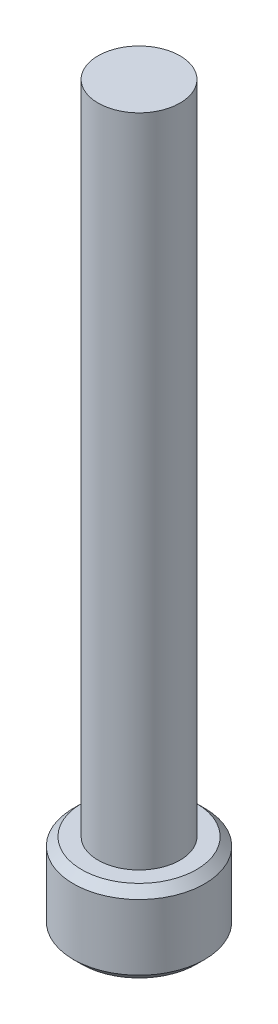
ISO-10303-21;
HEADER;
FILE_DESCRIPTION(('STEP AP214'),'2;1');
FILE_NAME('part.step','',(''),(''),'','','');
FILE_SCHEMA(('AUTOMOTIVE_DESIGN { 1 0 10303 214 1 1 1 1 }'));
ENDSEC;
DATA;
#1=APPLICATION_CONTEXT('core data for automotive mechanical design processes');
#2=APPLICATION_PROTOCOL_DEFINITION('international standard','automotive_design',2000,#1);
#3=PRODUCT_CONTEXT('',#1,'mechanical');
#4=PRODUCT('Part','Part','',(#3));
#5=PRODUCT_RELATED_PRODUCT_CATEGORY('part','',(#4));
#6=PRODUCT_DEFINITION_FORMATION('','',#4);
#7=PRODUCT_DEFINITION_CONTEXT('part definition',#1,'design');
#8=PRODUCT_DEFINITION('design','',#6,#7);
#9=PRODUCT_DEFINITION_SHAPE('','',#8);
#10=(LENGTH_UNIT() NAMED_UNIT(*) SI_UNIT(.MILLI.,.METRE.));
#11=(NAMED_UNIT(*) PLANE_ANGLE_UNIT() SI_UNIT($,.RADIAN.));
#12=(NAMED_UNIT(*) SI_UNIT($,.STERADIAN.) SOLID_ANGLE_UNIT());
#13=UNCERTAINTY_MEASURE_WITH_UNIT(LENGTH_MEASURE(1.E-05),#10,'distance_accuracy_value','');
#14=(GEOMETRIC_REPRESENTATION_CONTEXT(3) GLOBAL_UNCERTAINTY_ASSIGNED_CONTEXT((#13)) GLOBAL_UNIT_ASSIGNED_CONTEXT((#10,
#11,#12)) REPRESENTATION_CONTEXT('',''));
#15=CARTESIAN_POINT('',(0.,0.,0.));
#16=DIRECTION('',(0.,0.,1.));
#17=DIRECTION('',(1.,0.,0.));
#18=AXIS2_PLACEMENT_3D('',#15,#16,#17);
#19=CARTESIAN_POINT('',(0.,40.,0.));
#20=DIRECTION('',(0.,-1.,0.));
#21=DIRECTION('',(0.,0.,-1.));
#22=AXIS2_PLACEMENT_3D('',#19,#20,#21);
#23=CYLINDRICAL_SURFACE('',#22,2.5);
#24=CARTESIAN_POINT('',(0.,40.,0.));
#25=DIRECTION('',(0.,1.,0.));
#26=DIRECTION('',(0.,0.,1.));
#27=AXIS2_PLACEMENT_3D('',#24,#25,#26);
#28=CIRCLE('',#27,2.5);
#29=CARTESIAN_POINT('',(0.,40.,2.5));
#30=VERTEX_POINT('',#29);
#31=EDGE_CURVE('E126',#30,#30,#28,.T.);
#32=ORIENTED_EDGE('',*,*,#31,.F.);
#33=EDGE_LOOP('',(#32));
#34=FACE_BOUND('',#33,.T.);
#35=CARTESIAN_POINT('',(0.,0.,0.));
#36=DIRECTION('',(0.,-1.,0.));
#37=DIRECTION('',(0.,0.,-1.));
#38=AXIS2_PLACEMENT_3D('',#35,#36,#37);
#39=CIRCLE('',#38,2.5);
#40=CARTESIAN_POINT('',(0.,0.,-2.5));
#41=VERTEX_POINT('',#40);
#42=EDGE_CURVE('E116',#41,#41,#39,.T.);
#43=ORIENTED_EDGE('',*,*,#42,.F.);
#44=EDGE_LOOP('',(#43));
#45=FACE_BOUND('',#44,.T.);
#46=ADVANCED_FACE('F32',(#34,#45),#23,.T.);
#47=CARTESIAN_POINT('',(0.,40.,0.));
#48=DIRECTION('',(0.,1.,0.));
#49=DIRECTION('',(0.,0.,1.));
#50=AXIS2_PLACEMENT_3D('',#47,#48,#49);
#51=PLANE('',#50);
#52=ORIENTED_EDGE('',*,*,#31,.T.);
#53=EDGE_LOOP('',(#52));
#54=FACE_BOUND('',#53,.T.);
#55=ADVANCED_FACE('F184',(#54),#51,.T.);
#56=CARTESIAN_POINT('',(0.,0.,0.));
#57=DIRECTION('',(0.,-1.,0.));
#58=DIRECTION('',(0.,0.,-1.));
#59=AXIS2_PLACEMENT_3D('',#56,#57,#58);
#60=PLANE('',#59);
#61=CARTESIAN_POINT('',(0.,0.,0.));
#62=DIRECTION('',(0.,-1.,0.));
#63=DIRECTION('',(0.,0.,-1.));
#64=AXIS2_PLACEMENT_3D('',#61,#62,#63);
#65=CIRCLE('',#64,3.49999999999999);
#66=CARTESIAN_POINT('',(0.,0.,-3.49999999999999));
#67=VERTEX_POINT('',#66);
#68=EDGE_CURVE('E11',#67,#67,#65,.F.);
#69=ORIENTED_EDGE('',*,*,#68,.T.);
#70=EDGE_LOOP('',(#69));
#71=FACE_BOUND('',#70,.T.);
#72=ORIENTED_EDGE('',*,*,#42,.T.);
#73=EDGE_LOOP('',(#72));
#74=FACE_BOUND('',#73,.T.);
#75=ADVANCED_FACE('F190',(#71,#74),#60,.F.);
#76=CARTESIAN_POINT('',(0.,-5.,0.));
#77=DIRECTION('',(0.,-1.,0.));
#78=DIRECTION('',(0.,0.,-1.));
#79=AXIS2_PLACEMENT_3D('',#76,#77,#78);
#80=CYLINDRICAL_SURFACE('',#79,4.);
#81=CARTESIAN_POINT('',(0.,-4.5,0.));
#82=DIRECTION('',(0.,1.,0.));
#83=DIRECTION('',(0.,0.,1.));
#84=AXIS2_PLACEMENT_3D('',#81,#82,#83);
#85=CIRCLE('',#84,4.);
#86=CARTESIAN_POINT('',(0.,-4.5,4.));
#87=VERTEX_POINT('',#86);
#88=EDGE_CURVE('E40',#87,#87,#85,.T.);
#89=ORIENTED_EDGE('',*,*,#88,.T.);
#90=EDGE_LOOP('',(#89));
#91=FACE_BOUND('',#90,.T.);
#92=CARTESIAN_POINT('',(0.,-0.500000000000007,0.));
#93=DIRECTION('',(0.,-1.,0.));
#94=DIRECTION('',(0.,0.,-1.));
#95=AXIS2_PLACEMENT_3D('',#92,#93,#94);
#96=CIRCLE('',#95,4.);
#97=CARTESIAN_POINT('',(0.,-0.500000000000007,-4.));
#98=VERTEX_POINT('',#97);
#99=EDGE_CURVE('E146',#98,#98,#96,.T.);
#100=ORIENTED_EDGE('',*,*,#99,.T.);
#101=EDGE_LOOP('',(#100));
#102=FACE_BOUND('',#101,.T.);
#103=ADVANCED_FACE('F151',(#91,#102),#80,.T.);
#104=CARTESIAN_POINT('',(-4.,-5.,0.));
#105=DIRECTION('',(0.,1.,0.));
#106=DIRECTION('',(0.,0.,1.));
#107=AXIS2_PLACEMENT_3D('',#104,#105,#106);
#108=PLANE('',#107);
#109=CARTESIAN_POINT('',(0.,-5.,0.));
#110=DIRECTION('',(0.,1.,0.));
#111=DIRECTION('',(0.,0.,1.));
#112=AXIS2_PLACEMENT_3D('',#109,#110,#111);
#113=CIRCLE('',#112,3.5);
#114=CARTESIAN_POINT('',(0.,-5.,3.5));
#115=VERTEX_POINT('',#114);
#116=EDGE_CURVE('E143',#115,#115,#113,.F.);
#117=ORIENTED_EDGE('',*,*,#116,.T.);
#118=EDGE_LOOP('',(#117));
#119=FACE_BOUND('',#118,.T.);
#120=DIRECTION('',(1.,0.,0.));
#121=VECTOR('',#120,1.);
#122=CARTESIAN_POINT('',(-4.,-5.,2.5));
#123=LINE('',#122,#121);
#124=CARTESIAN_POINT('',(-1.44337567297406,-5.,2.5));
#125=VERTEX_POINT('',#124);
#126=CARTESIAN_POINT('',(1.44337567297407,-5.,2.5));
#127=VERTEX_POINT('',#126);
#128=EDGE_CURVE('E139',#125,#127,#123,.T.);
#129=ORIENTED_EDGE('',*,*,#128,.T.);
#130=DIRECTION('',(0.5,0.,-0.866025403784439));
#131=VECTOR('',#130,1.);
#132=CARTESIAN_POINT('',(1.1650635094611,-5.,2.98205080756888));
#133=LINE('',#132,#131);
#134=CARTESIAN_POINT('',(2.88675134594813,-5.,0.));
#135=VERTEX_POINT('',#134);
#136=EDGE_CURVE('E55',#127,#135,#133,.T.);
#137=ORIENTED_EDGE('',*,*,#136,.T.);
#138=DIRECTION('',(-0.5,0.,-0.866025403784439));
#139=VECTOR('',#138,1.);
#140=CARTESIAN_POINT('',(1.1650635094611,-5.,-2.98205080756888));
#141=LINE('',#140,#139);
#142=CARTESIAN_POINT('',(1.44337567297406,-5.,-2.5));
#143=VERTEX_POINT('',#142);
#144=EDGE_CURVE('E88',#135,#143,#141,.T.);
#145=ORIENTED_EDGE('',*,*,#144,.T.);
#146=DIRECTION('',(-1.,0.,0.));
#147=VECTOR('',#146,1.);
#148=CARTESIAN_POINT('',(-4.,-5.,-2.5));
#149=LINE('',#148,#147);
#150=CARTESIAN_POINT('',(-1.44337567297406,-5.,-2.5));
#151=VERTEX_POINT('',#150);
#152=EDGE_CURVE('E130',#143,#151,#149,.T.);
#153=ORIENTED_EDGE('',*,*,#152,.T.);
#154=DIRECTION('',(-0.5,0.,0.866025403784439));
#155=VECTOR('',#154,1.);
#156=CARTESIAN_POINT('',(-3.1650635094611,-5.,0.482050807568877));
#157=LINE('',#156,#155);
#158=CARTESIAN_POINT('',(-2.88675134594813,-5.,0.));
#159=VERTEX_POINT('',#158);
#160=EDGE_CURVE('E133',#151,#159,#157,.T.);
#161=ORIENTED_EDGE('',*,*,#160,.T.);
#162=DIRECTION('',(0.5,0.,0.866025403784439));
#163=VECTOR('',#162,1.);
#164=CARTESIAN_POINT('',(-3.1650635094611,-5.,-0.482050807568877));
#165=LINE('',#164,#163);
#166=EDGE_CURVE('E136',#159,#125,#165,.T.);
#167=ORIENTED_EDGE('',*,*,#166,.T.);
#168=EDGE_LOOP('',(#129,#137,#145,#153,#161,#167));
#169=FACE_BOUND('',#168,.T.);
#170=ADVANCED_FACE('F159',(#119,#169),#108,.F.);
#171=CARTESIAN_POINT('',(1.44337567297407,-31.,2.5));
#172=DIRECTION('',(0.866025403784439,0.,0.5));
#173=DIRECTION('',(0.5,0.,-0.866025403784439));
#174=AXIS2_PLACEMENT_3D('',#171,#172,#173);
#175=PLANE('',#174);
#176=DIRECTION('',(0.,1.,0.));
#177=VECTOR('',#176,1.);
#178=CARTESIAN_POINT('',(1.44337567297407,-31.,2.5));
#179=LINE('',#178,#177);
#180=CARTESIAN_POINT('',(1.44337567297407,-1.,2.5));
#181=VERTEX_POINT('',#180);
#182=EDGE_CURVE('E104',#127,#181,#179,.T.);
#183=ORIENTED_EDGE('',*,*,#182,.T.);
#184=DIRECTION('',(0.5,0.,-0.866025403784439));
#185=VECTOR('',#184,1.);
#186=CARTESIAN_POINT('',(1.44337567297407,-1.,2.5));
#187=LINE('',#186,#185);
#188=CARTESIAN_POINT('',(2.88675134594813,-1.,0.));
#189=VERTEX_POINT('',#188);
#190=EDGE_CURVE('E97',#181,#189,#187,.T.);
#191=ORIENTED_EDGE('',*,*,#190,.T.);
#192=DIRECTION('',(0.,1.,0.));
#193=VECTOR('',#192,1.);
#194=CARTESIAN_POINT('',(2.88675134594813,-31.,0.));
#195=LINE('',#194,#193);
#196=EDGE_CURVE('E83',#135,#189,#195,.T.);
#197=ORIENTED_EDGE('',*,*,#196,.F.);
#198=ORIENTED_EDGE('',*,*,#136,.F.);
#199=EDGE_LOOP('',(#183,#191,#197,#198));
#200=FACE_BOUND('',#199,.T.);
#201=ADVANCED_FACE('F103',(#200),#175,.F.);
#202=CARTESIAN_POINT('',(-1.44337567297406,-31.,2.5));
#203=DIRECTION('',(0.,0.,1.));
#204=DIRECTION('',(1.,0.,0.));
#205=AXIS2_PLACEMENT_3D('',#202,#203,#204);
#206=PLANE('',#205);
#207=DIRECTION('',(0.,1.,0.));
#208=VECTOR('',#207,1.);
#209=CARTESIAN_POINT('',(-1.44337567297406,-31.,2.5));
#210=LINE('',#209,#208);
#211=CARTESIAN_POINT('',(-1.44337567297406,-1.,2.5));
#212=VERTEX_POINT('',#211);
#213=EDGE_CURVE('E117',#125,#212,#210,.T.);
#214=ORIENTED_EDGE('',*,*,#213,.T.);
#215=DIRECTION('',(1.,0.,0.));
#216=VECTOR('',#215,1.);
#217=CARTESIAN_POINT('',(-1.44337567297406,-1.,2.5));
#218=LINE('',#217,#216);
#219=EDGE_CURVE('E90',#212,#181,#218,.T.);
#220=ORIENTED_EDGE('',*,*,#219,.T.);
#221=ORIENTED_EDGE('',*,*,#182,.F.);
#222=ORIENTED_EDGE('',*,*,#128,.F.);
#223=EDGE_LOOP('',(#214,#220,#221,#222));
#224=FACE_BOUND('',#223,.T.);
#225=ADVANCED_FACE('F165',(#224),#206,.F.);
#226=CARTESIAN_POINT('',(-2.88675134594813,-31.,0.));
#227=DIRECTION('',(-0.866025403784439,0.,0.5));
#228=DIRECTION('',(0.5,0.,0.866025403784439));
#229=AXIS2_PLACEMENT_3D('',#226,#227,#228);
#230=PLANE('',#229);
#231=DIRECTION('',(0.,1.,0.));
#232=VECTOR('',#231,1.);
#233=CARTESIAN_POINT('',(-2.88675134594813,-31.,0.));
#234=LINE('',#233,#232);
#235=CARTESIAN_POINT('',(-2.88675134594813,-1.,0.));
#236=VERTEX_POINT('',#235);
#237=EDGE_CURVE('E119',#159,#236,#234,.T.);
#238=ORIENTED_EDGE('',*,*,#237,.T.);
#239=DIRECTION('',(0.5,0.,0.866025403784439));
#240=VECTOR('',#239,1.);
#241=CARTESIAN_POINT('',(-2.88675134594813,-1.,0.));
#242=LINE('',#241,#240);
#243=EDGE_CURVE('E111',#236,#212,#242,.T.);
#244=ORIENTED_EDGE('',*,*,#243,.T.);
#245=ORIENTED_EDGE('',*,*,#213,.F.);
#246=ORIENTED_EDGE('',*,*,#166,.F.);
#247=EDGE_LOOP('',(#238,#244,#245,#246));
#248=FACE_BOUND('',#247,.T.);
#249=ADVANCED_FACE('F167',(#248),#230,.F.);
#250=CARTESIAN_POINT('',(-1.44337567297406,-31.,-2.5));
#251=DIRECTION('',(-0.866025403784439,0.,-0.5));
#252=DIRECTION('',(-0.5,0.,0.866025403784439));
#253=AXIS2_PLACEMENT_3D('',#250,#251,#252);
#254=PLANE('',#253);
#255=DIRECTION('',(0.,1.,0.));
#256=VECTOR('',#255,1.);
#257=CARTESIAN_POINT('',(-1.44337567297406,-31.,-2.5));
#258=LINE('',#257,#256);
#259=CARTESIAN_POINT('',(-1.44337567297406,-1.,-2.5));
#260=VERTEX_POINT('',#259);
#261=EDGE_CURVE('E121',#151,#260,#258,.T.);
#262=ORIENTED_EDGE('',*,*,#261,.T.);
#263=DIRECTION('',(-0.5,0.,0.866025403784439));
#264=VECTOR('',#263,1.);
#265=CARTESIAN_POINT('',(-1.44337567297406,-1.,-2.5));
#266=LINE('',#265,#264);
#267=EDGE_CURVE('E108',#260,#236,#266,.T.);
#268=ORIENTED_EDGE('',*,*,#267,.T.);
#269=ORIENTED_EDGE('',*,*,#237,.F.);
#270=ORIENTED_EDGE('',*,*,#160,.F.);
#271=EDGE_LOOP('',(#262,#268,#269,#270));
#272=FACE_BOUND('',#271,.T.);
#273=ADVANCED_FACE('F171',(#272),#254,.F.);
#274=CARTESIAN_POINT('',(1.44337567297406,-31.,-2.5));
#275=DIRECTION('',(0.,0.,-1.));
#276=DIRECTION('',(-1.,0.,0.));
#277=AXIS2_PLACEMENT_3D('',#274,#275,#276);
#278=PLANE('',#277);
#279=DIRECTION('',(0.,1.,0.));
#280=VECTOR('',#279,1.);
#281=CARTESIAN_POINT('',(1.44337567297406,-31.,-2.5));
#282=LINE('',#281,#280);
#283=CARTESIAN_POINT('',(1.44337567297406,-1.,-2.5));
#284=VERTEX_POINT('',#283);
#285=EDGE_CURVE('E47',#143,#284,#282,.T.);
#286=ORIENTED_EDGE('',*,*,#285,.T.);
#287=DIRECTION('',(-1.,0.,0.));
#288=VECTOR('',#287,1.);
#289=CARTESIAN_POINT('',(1.44337567297406,-1.,-2.5));
#290=LINE('',#289,#288);
#291=EDGE_CURVE('E101',#284,#260,#290,.T.);
#292=ORIENTED_EDGE('',*,*,#291,.T.);
#293=ORIENTED_EDGE('',*,*,#261,.F.);
#294=ORIENTED_EDGE('',*,*,#152,.F.);
#295=EDGE_LOOP('',(#286,#292,#293,#294));
#296=FACE_BOUND('',#295,.T.);
#297=ADVANCED_FACE('F174',(#296),#278,.F.);
#298=CARTESIAN_POINT('',(2.88675134594813,-31.,0.));
#299=DIRECTION('',(0.866025403784438,0.,-0.5));
#300=DIRECTION('',(-0.5,0.,-0.866025403784439));
#301=AXIS2_PLACEMENT_3D('',#298,#299,#300);
#302=PLANE('',#301);
#303=ORIENTED_EDGE('',*,*,#196,.T.);
#304=DIRECTION('',(-0.5,0.,-0.866025403784439));
#305=VECTOR('',#304,1.);
#306=CARTESIAN_POINT('',(2.88675134594813,-1.,0.));
#307=LINE('',#306,#305);
#308=EDGE_CURVE('E86',#189,#284,#307,.T.);
#309=ORIENTED_EDGE('',*,*,#308,.T.);
#310=ORIENTED_EDGE('',*,*,#285,.F.);
#311=ORIENTED_EDGE('',*,*,#144,.F.);
#312=EDGE_LOOP('',(#303,#309,#310,#311));
#313=FACE_BOUND('',#312,.T.);
#314=ADVANCED_FACE('F85',(#313),#302,.F.);
#315=CARTESIAN_POINT('',(0.,-1.,0.));
#316=DIRECTION('',(0.,1.,0.));
#317=DIRECTION('',(0.,0.,1.));
#318=AXIS2_PLACEMENT_3D('',#315,#316,#317);
#319=PLANE('',#318);
#320=ORIENTED_EDGE('',*,*,#190,.F.);
#321=ORIENTED_EDGE('',*,*,#219,.F.);
#322=ORIENTED_EDGE('',*,*,#243,.F.);
#323=ORIENTED_EDGE('',*,*,#267,.F.);
#324=ORIENTED_EDGE('',*,*,#291,.F.);
#325=ORIENTED_EDGE('',*,*,#308,.F.);
#326=EDGE_LOOP('',(#320,#321,#322,#323,#324,#325));
#327=FACE_BOUND('',#326,.T.);
#328=ADVANCED_FACE('F95',(#327),#319,.F.);
#329=CARTESIAN_POINT('',(0.,-5.,0.));
#330=DIRECTION('',(0.,1.,0.));
#331=DIRECTION('',(0.,0.,1.));
#332=AXIS2_PLACEMENT_3D('',#329,#330,#331);
#333=CONICAL_SURFACE('',#332,3.5,0.785398163397448);
#334=ORIENTED_EDGE('',*,*,#88,.F.);
#335=EDGE_LOOP('',(#334));
#336=FACE_BOUND('',#335,.T.);
#337=ORIENTED_EDGE('',*,*,#116,.F.);
#338=EDGE_LOOP('',(#337));
#339=FACE_BOUND('',#338,.T.);
#340=ADVANCED_FACE('F154',(#336,#339),#333,.T.);
#341=CARTESIAN_POINT('',(0.,-0.500000000000007,0.));
#342=DIRECTION('',(0.,-1.,0.));
#343=DIRECTION('',(0.,0.,-1.));
#344=AXIS2_PLACEMENT_3D('',#341,#342,#343);
#345=CONICAL_SURFACE('',#344,4.,0.785398163397452);
#346=ORIENTED_EDGE('',*,*,#68,.F.);
#347=EDGE_LOOP('',(#346));
#348=FACE_BOUND('',#347,.T.);
#349=ORIENTED_EDGE('',*,*,#99,.F.);
#350=EDGE_LOOP('',(#349));
#351=FACE_BOUND('',#350,.T.);
#352=ADVANCED_FACE('F34',(#348,#351),#345,.T.);
#353=CLOSED_SHELL('',(#46,#55,#75,#103,#170,#201,#225,#249,#273,#297,#314,#328,#340,#352));
#354=MANIFOLD_SOLID_BREP('B2',#353);
#355=ADVANCED_BREP_SHAPE_REPRESENTATION('',(#18,#354),#14);
#356=SHAPE_DEFINITION_REPRESENTATION(#9,#355);
ENDSEC;
END-ISO-10303-21;
